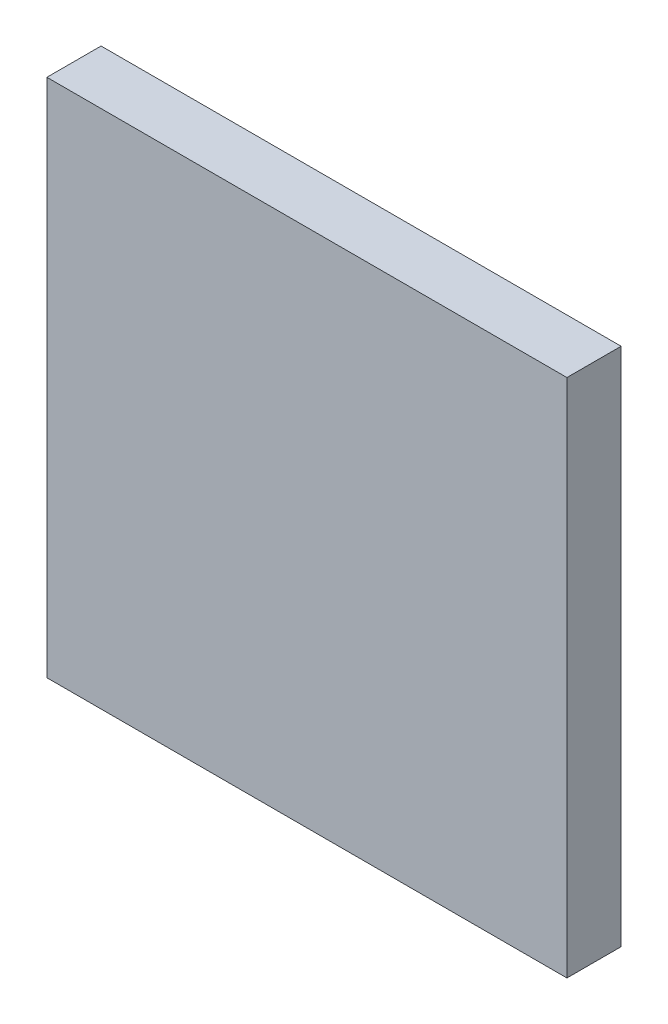
ISO-10303-21;
HEADER;
FILE_DESCRIPTION(('STEP AP214'),'2;1');
FILE_NAME('part.step','',(''),(''),'','','');
FILE_SCHEMA(('AUTOMOTIVE_DESIGN { 1 0 10303 214 1 1 1 1 }'));
ENDSEC;
DATA;
#1=APPLICATION_CONTEXT('core data for automotive mechanical design processes');
#2=APPLICATION_PROTOCOL_DEFINITION('international standard','automotive_design',2000,#1);
#3=PRODUCT_CONTEXT('',#1,'mechanical');
#4=PRODUCT('Part','Part','',(#3));
#5=PRODUCT_RELATED_PRODUCT_CATEGORY('part','',(#4));
#6=PRODUCT_DEFINITION_FORMATION('','',#4);
#7=PRODUCT_DEFINITION_CONTEXT('part definition',#1,'design');
#8=PRODUCT_DEFINITION('design','',#6,#7);
#9=PRODUCT_DEFINITION_SHAPE('','',#8);
#10=(LENGTH_UNIT() NAMED_UNIT(*) SI_UNIT(.MILLI.,.METRE.));
#11=(NAMED_UNIT(*) PLANE_ANGLE_UNIT() SI_UNIT($,.RADIAN.));
#12=(NAMED_UNIT(*) SI_UNIT($,.STERADIAN.) SOLID_ANGLE_UNIT());
#13=UNCERTAINTY_MEASURE_WITH_UNIT(LENGTH_MEASURE(1.E-05),#10,'distance_accuracy_value','');
#14=(GEOMETRIC_REPRESENTATION_CONTEXT(3) GLOBAL_UNCERTAINTY_ASSIGNED_CONTEXT((#13)) GLOBAL_UNIT_ASSIGNED_CONTEXT((#10,
#11,#12)) REPRESENTATION_CONTEXT('',''));
#15=CARTESIAN_POINT('',(0.,0.,0.));
#16=DIRECTION('',(0.,0.,1.));
#17=DIRECTION('',(1.,0.,0.));
#18=AXIS2_PLACEMENT_3D('',#15,#16,#17);
#19=CARTESIAN_POINT('',(0.52,-2.08,0.));
#20=DIRECTION('',(1.,0.,0.));
#21=DIRECTION('',(0.,0.,1.));
#22=AXIS2_PLACEMENT_3D('',#19,#20,#21);
#23=PLANE('',#22);
#24=DIRECTION('',(0.,1.,0.));
#25=VECTOR('',#24,1.);
#26=CARTESIAN_POINT('',(0.52,-2.08,0.1));
#27=LINE('',#26,#25);
#28=CARTESIAN_POINT('',(0.52,-2.08,0.1));
#29=VERTEX_POINT('',#28);
#30=CARTESIAN_POINT('',(0.52,-1.12,0.1));
#31=VERTEX_POINT('',#30);
#32=EDGE_CURVE('E11',#29,#31,#27,.T.);
#33=ORIENTED_EDGE('',*,*,#32,.T.);
#34=DIRECTION('',(0.,0.,1.));
#35=VECTOR('',#34,1.);
#36=CARTESIAN_POINT('',(0.52,-1.12,0.));
#37=LINE('',#36,#35);
#38=CARTESIAN_POINT('',(0.52,-1.12,0.));
#39=VERTEX_POINT('',#38);
#40=EDGE_CURVE('E23',#39,#31,#37,.T.);
#41=ORIENTED_EDGE('',*,*,#40,.F.);
#42=DIRECTION('',(0.,1.,0.));
#43=VECTOR('',#42,1.);
#44=CARTESIAN_POINT('',(0.52,-2.08,0.));
#45=LINE('',#44,#43);
#46=CARTESIAN_POINT('',(0.52,-2.08,0.));
#47=VERTEX_POINT('',#46);
#48=EDGE_CURVE('E85',#47,#39,#45,.T.);
#49=ORIENTED_EDGE('',*,*,#48,.F.);
#50=DIRECTION('',(0.,0.,1.));
#51=VECTOR('',#50,1.);
#52=CARTESIAN_POINT('',(0.52,-2.08,0.));
#53=LINE('',#52,#51);
#54=EDGE_CURVE('E35',#47,#29,#53,.T.);
#55=ORIENTED_EDGE('',*,*,#54,.T.);
#56=EDGE_LOOP('',(#33,#41,#49,#55));
#57=FACE_BOUND('',#56,.T.);
#58=ADVANCED_FACE('F16',(#57),#23,.F.);
#59=CARTESIAN_POINT('',(1.48,-2.08,0.));
#60=DIRECTION('',(1.,0.,0.));
#61=DIRECTION('',(0.,0.,1.));
#62=AXIS2_PLACEMENT_3D('',#59,#60,#61);
#63=PLANE('',#62);
#64=DIRECTION('',(0.,0.,1.));
#65=VECTOR('',#64,1.);
#66=CARTESIAN_POINT('',(1.48,-2.08,0.));
#67=LINE('',#66,#65);
#68=CARTESIAN_POINT('',(1.48,-2.08,0.));
#69=VERTEX_POINT('',#68);
#70=CARTESIAN_POINT('',(1.48,-2.08,0.1));
#71=VERTEX_POINT('',#70);
#72=EDGE_CURVE('E82',#69,#71,#67,.T.);
#73=ORIENTED_EDGE('',*,*,#72,.F.);
#74=DIRECTION('',(0.,1.,0.));
#75=VECTOR('',#74,1.);
#76=CARTESIAN_POINT('',(1.48,-2.08,0.));
#77=LINE('',#76,#75);
#78=CARTESIAN_POINT('',(1.48,-1.12,0.));
#79=VERTEX_POINT('',#78);
#80=EDGE_CURVE('E62',#69,#79,#77,.T.);
#81=ORIENTED_EDGE('',*,*,#80,.T.);
#82=DIRECTION('',(0.,0.,1.));
#83=VECTOR('',#82,1.);
#84=CARTESIAN_POINT('',(1.48,-1.12,0.));
#85=LINE('',#84,#83);
#86=CARTESIAN_POINT('',(1.48,-1.12,0.1));
#87=VERTEX_POINT('',#86);
#88=EDGE_CURVE('E56',#79,#87,#85,.T.);
#89=ORIENTED_EDGE('',*,*,#88,.T.);
#90=DIRECTION('',(0.,1.,0.));
#91=VECTOR('',#90,1.);
#92=CARTESIAN_POINT('',(1.48,-2.08,0.1));
#93=LINE('',#92,#91);
#94=EDGE_CURVE('E59',#71,#87,#93,.T.);
#95=ORIENTED_EDGE('',*,*,#94,.F.);
#96=EDGE_LOOP('',(#73,#81,#89,#95));
#97=FACE_BOUND('',#96,.T.);
#98=ADVANCED_FACE('F58',(#97),#63,.T.);
#99=CARTESIAN_POINT('',(0.52,-2.08,0.));
#100=DIRECTION('',(0.,1.,0.));
#101=DIRECTION('',(0.,0.,1.));
#102=AXIS2_PLACEMENT_3D('',#99,#100,#101);
#103=PLANE('',#102);
#104=ORIENTED_EDGE('',*,*,#72,.T.);
#105=DIRECTION('',(1.,0.,0.));
#106=VECTOR('',#105,1.);
#107=CARTESIAN_POINT('',(0.52,-2.08,0.1));
#108=LINE('',#107,#106);
#109=EDGE_CURVE('E70',#29,#71,#108,.T.);
#110=ORIENTED_EDGE('',*,*,#109,.F.);
#111=ORIENTED_EDGE('',*,*,#54,.F.);
#112=DIRECTION('',(1.,0.,0.));
#113=VECTOR('',#112,1.);
#114=CARTESIAN_POINT('',(0.52,-2.08,0.));
#115=LINE('',#114,#113);
#116=EDGE_CURVE('E75',#47,#69,#115,.T.);
#117=ORIENTED_EDGE('',*,*,#116,.T.);
#118=EDGE_LOOP('',(#104,#110,#111,#117));
#119=FACE_BOUND('',#118,.T.);
#120=ADVANCED_FACE('F90',(#119),#103,.F.);
#121=CARTESIAN_POINT('',(0.52,-1.12,0.));
#122=DIRECTION('',(0.,1.,0.));
#123=DIRECTION('',(0.,0.,1.));
#124=AXIS2_PLACEMENT_3D('',#121,#122,#123);
#125=PLANE('',#124);
#126=DIRECTION('',(1.,0.,0.));
#127=VECTOR('',#126,1.);
#128=CARTESIAN_POINT('',(0.52,-1.12,0.));
#129=LINE('',#128,#127);
#130=EDGE_CURVE('E73',#39,#79,#129,.T.);
#131=ORIENTED_EDGE('',*,*,#130,.F.);
#132=ORIENTED_EDGE('',*,*,#40,.T.);
#133=DIRECTION('',(1.,0.,0.));
#134=VECTOR('',#133,1.);
#135=CARTESIAN_POINT('',(0.52,-1.12,0.1));
#136=LINE('',#135,#134);
#137=EDGE_CURVE('E68',#31,#87,#136,.T.);
#138=ORIENTED_EDGE('',*,*,#137,.T.);
#139=ORIENTED_EDGE('',*,*,#88,.F.);
#140=EDGE_LOOP('',(#131,#132,#138,#139));
#141=FACE_BOUND('',#140,.T.);
#142=ADVANCED_FACE('F72',(#141),#125,.T.);
#143=CARTESIAN_POINT('',(0.52,-2.08,0.));
#144=DIRECTION('',(0.,0.,1.));
#145=DIRECTION('',(1.,0.,0.));
#146=AXIS2_PLACEMENT_3D('',#143,#144,#145);
#147=PLANE('',#146);
#148=ORIENTED_EDGE('',*,*,#130,.T.);
#149=ORIENTED_EDGE('',*,*,#80,.F.);
#150=ORIENTED_EDGE('',*,*,#116,.F.);
#151=ORIENTED_EDGE('',*,*,#48,.T.);
#152=EDGE_LOOP('',(#148,#149,#150,#151));
#153=FACE_BOUND('',#152,.T.);
#154=ADVANCED_FACE('F88',(#153),#147,.F.);
#155=CARTESIAN_POINT('',(0.52,-2.08,0.1));
#156=DIRECTION('',(0.,0.,1.));
#157=DIRECTION('',(1.,0.,0.));
#158=AXIS2_PLACEMENT_3D('',#155,#156,#157);
#159=PLANE('',#158);
#160=ORIENTED_EDGE('',*,*,#32,.F.);
#161=ORIENTED_EDGE('',*,*,#109,.T.);
#162=ORIENTED_EDGE('',*,*,#94,.T.);
#163=ORIENTED_EDGE('',*,*,#137,.F.);
#164=EDGE_LOOP('',(#160,#161,#162,#163));
#165=FACE_BOUND('',#164,.T.);
#166=ADVANCED_FACE('F67',(#165),#159,.T.);
#167=CLOSED_SHELL('',(#58,#98,#120,#142,#154,#166));
#168=MANIFOLD_SOLID_BREP('B1',#167);
#169=ADVANCED_BREP_SHAPE_REPRESENTATION('',(#18,#168),#14);
#170=SHAPE_DEFINITION_REPRESENTATION(#9,#169);
ENDSEC;
END-ISO-10303-21;
